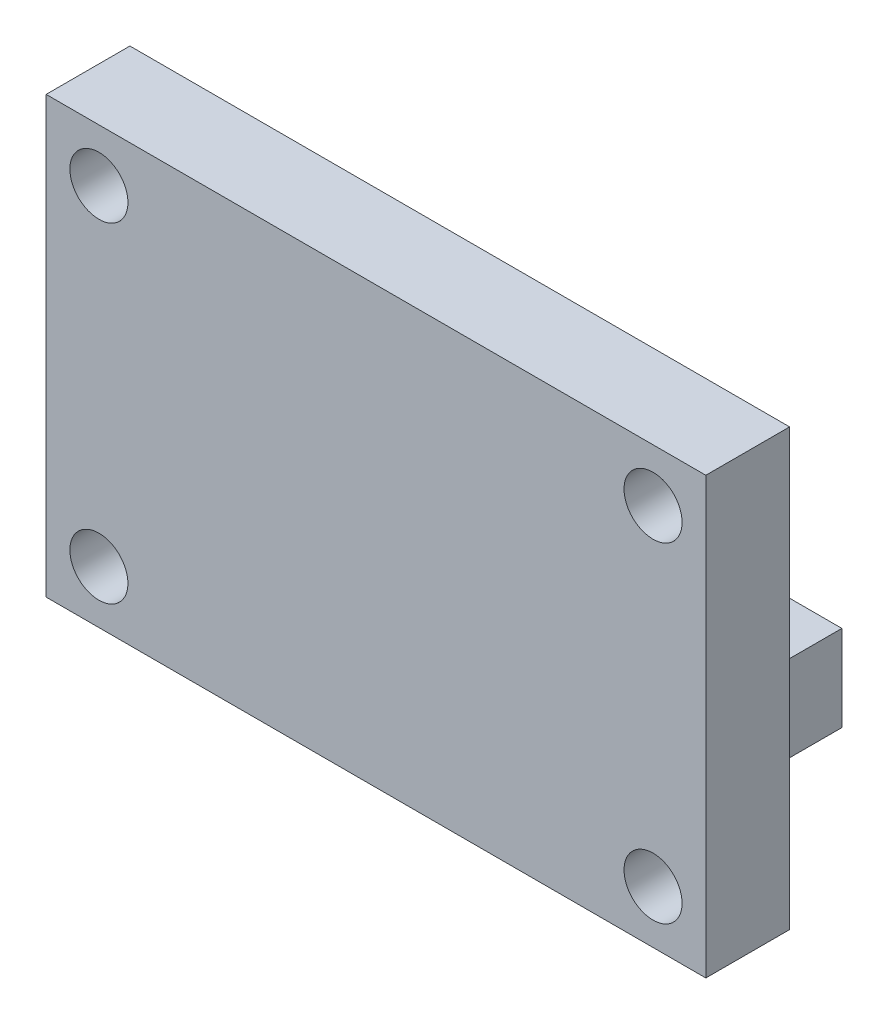
ISO-10303-21;
HEADER;
FILE_DESCRIPTION(('STEP AP214'),'2;1');
FILE_NAME('part.step','',(''),(''),'','','');
FILE_SCHEMA(('AUTOMOTIVE_DESIGN { 1 0 10303 214 1 1 1 1 }'));
ENDSEC;
DATA;
#1=APPLICATION_CONTEXT('core data for automotive mechanical design processes');
#2=APPLICATION_PROTOCOL_DEFINITION('international standard','automotive_design',2000,#1);
#3=PRODUCT_CONTEXT('',#1,'mechanical');
#4=PRODUCT('Part','Part','',(#3));
#5=PRODUCT_RELATED_PRODUCT_CATEGORY('part','',(#4));
#6=PRODUCT_DEFINITION_FORMATION('','',#4);
#7=PRODUCT_DEFINITION_CONTEXT('part definition',#1,'design');
#8=PRODUCT_DEFINITION('design','',#6,#7);
#9=PRODUCT_DEFINITION_SHAPE('','',#8);
#10=(LENGTH_UNIT() NAMED_UNIT(*) SI_UNIT(.MILLI.,.METRE.));
#11=(NAMED_UNIT(*) PLANE_ANGLE_UNIT() SI_UNIT($,.RADIAN.));
#12=(NAMED_UNIT(*) SI_UNIT($,.STERADIAN.) SOLID_ANGLE_UNIT());
#13=UNCERTAINTY_MEASURE_WITH_UNIT(LENGTH_MEASURE(1.E-05),#10,'distance_accuracy_value','');
#14=(GEOMETRIC_REPRESENTATION_CONTEXT(3) GLOBAL_UNCERTAINTY_ASSIGNED_CONTEXT((#13)) GLOBAL_UNIT_ASSIGNED_CONTEXT((#10,
#11,#12)) REPRESENTATION_CONTEXT('',''));
#15=CARTESIAN_POINT('',(0.,0.,0.));
#16=DIRECTION('',(0.,0.,1.));
#17=DIRECTION('',(1.,0.,0.));
#18=AXIS2_PLACEMENT_3D('',#15,#16,#17);
#19=CARTESIAN_POINT('',(0.,0.,-3.175));
#20=DIRECTION('',(0.,0.,1.));
#21=DIRECTION('',(1.,0.,0.));
#22=AXIS2_PLACEMENT_3D('',#19,#20,#21);
#23=PLANE('',#22);
#24=CARTESIAN_POINT('',(-10.2118543920502,9.97230495104325,-3.175));
#25=DIRECTION('',(0.,0.,1.));
#26=DIRECTION('',(1.,0.,0.));
#27=AXIS2_PLACEMENT_3D('',#24,#25,#26);
#28=CIRCLE('',#27,1.1);
#29=CARTESIAN_POINT('',(-9.11185439205018,9.97230495104325,-3.175));
#30=VERTEX_POINT('',#29);
#31=EDGE_CURVE('E220',#30,#30,#28,.T.);
#32=ORIENTED_EDGE('',*,*,#31,.T.);
#33=EDGE_LOOP('',(#32));
#34=FACE_BOUND('',#33,.T.);
#35=CARTESIAN_POINT('',(-10.2118543920502,-2.52769504895675,-3.175));
#36=DIRECTION('',(0.,0.,1.));
#37=DIRECTION('',(1.,0.,0.));
#38=AXIS2_PLACEMENT_3D('',#35,#36,#37);
#39=CIRCLE('',#38,1.1);
#40=CARTESIAN_POINT('',(-9.11185439205018,-2.52769504895675,-3.175));
#41=VERTEX_POINT('',#40);
#42=EDGE_CURVE('E212',#41,#41,#39,.T.);
#43=ORIENTED_EDGE('',*,*,#42,.T.);
#44=EDGE_LOOP('',(#43));
#45=FACE_BOUND('',#44,.T.);
#46=CARTESIAN_POINT('',(10.7881456079498,9.97230495104325,-3.175));
#47=DIRECTION('',(0.,0.,1.));
#48=DIRECTION('',(1.,0.,0.));
#49=AXIS2_PLACEMENT_3D('',#46,#47,#48);
#50=CIRCLE('',#49,1.1);
#51=CARTESIAN_POINT('',(11.8881456079498,9.97230495104325,-3.175));
#52=VERTEX_POINT('',#51);
#53=EDGE_CURVE('E204',#52,#52,#50,.T.);
#54=ORIENTED_EDGE('',*,*,#53,.T.);
#55=EDGE_LOOP('',(#54));
#56=FACE_BOUND('',#55,.T.);
#57=CARTESIAN_POINT('',(10.7881456079498,-2.52769504895675,-3.175));
#58=DIRECTION('',(0.,0.,1.));
#59=DIRECTION('',(1.,0.,0.));
#60=AXIS2_PLACEMENT_3D('',#57,#58,#59);
#61=CIRCLE('',#60,1.1);
#62=CARTESIAN_POINT('',(11.8881456079498,-2.52769504895675,-3.175));
#63=VERTEX_POINT('',#62);
#64=EDGE_CURVE('E196',#63,#63,#61,.T.);
#65=ORIENTED_EDGE('',*,*,#64,.T.);
#66=EDGE_LOOP('',(#65));
#67=FACE_BOUND('',#66,.T.);
#68=DIRECTION('',(1.,0.,0.));
#69=VECTOR('',#68,1.);
#70=CARTESIAN_POINT('',(7.1487666114029,-1.27084971749305,-3.175));
#71=LINE('',#70,#69);
#72=CARTESIAN_POINT('',(1.27,-1.27084971749305,-3.175));
#73=VERTEX_POINT('',#72);
#74=CARTESIAN_POINT('',(7.1487666114029,-1.27084971749305,-3.175));
#75=VERTEX_POINT('',#74);
#76=EDGE_CURVE('E133',#73,#75,#71,.T.);
#77=ORIENTED_EDGE('',*,*,#76,.F.);
#78=DIRECTION('',(0.,1.,0.));
#79=VECTOR('',#78,1.);
#80=CARTESIAN_POINT('',(1.27,0.,-3.175));
#81=LINE('',#80,#79);
#82=CARTESIAN_POINT('',(1.27,6.02181207758508,-3.175));
#83=VERTEX_POINT('',#82);
#84=EDGE_CURVE('E57',#73,#83,#81,.T.);
#85=ORIENTED_EDGE('',*,*,#84,.T.);
#86=DIRECTION('',(1.,0.,0.));
#87=VECTOR('',#86,1.);
#88=CARTESIAN_POINT('',(0.,6.02181207758508,-3.175));
#89=LINE('',#88,#87);
#90=CARTESIAN_POINT('',(-1.27,6.02181207758508,-3.175));
#91=VERTEX_POINT('',#90);
#92=EDGE_CURVE('E61',#83,#91,#89,.F.);
#93=ORIENTED_EDGE('',*,*,#92,.T.);
#94=DIRECTION('',(0.,1.,0.));
#95=VECTOR('',#94,1.);
#96=CARTESIAN_POINT('',(-1.27,0.,-3.175));
#97=LINE('',#96,#95);
#98=CARTESIAN_POINT('',(-1.27,-1.27084971749305,-3.175));
#99=VERTEX_POINT('',#98);
#100=EDGE_CURVE('E135',#99,#91,#97,.T.);
#101=ORIENTED_EDGE('',*,*,#100,.F.);
#102=CARTESIAN_POINT('',(-6.86385312151863,-1.27084971749305,-3.175));
#103=VERTEX_POINT('',#102);
#104=EDGE_CURVE('E122',#103,#99,#71,.T.);
#105=ORIENTED_EDGE('',*,*,#104,.F.);
#106=DIRECTION('',(0.,1.,0.));
#107=VECTOR('',#106,1.);
#108=CARTESIAN_POINT('',(-6.86385312151863,-4.52769504895675,-3.175));
#109=LINE('',#108,#107);
#110=CARTESIAN_POINT('',(-6.86385312151863,-4.52769504895675,-3.175));
#111=VERTEX_POINT('',#110);
#112=EDGE_CURVE('E179',#111,#103,#109,.T.);
#113=ORIENTED_EDGE('',*,*,#112,.F.);
#114=DIRECTION('',(1.,0.,0.));
#115=VECTOR('',#114,1.);
#116=CARTESIAN_POINT('',(-12.2118543920502,-4.52769504895675,-3.175));
#117=LINE('',#116,#115);
#118=CARTESIAN_POINT('',(-12.2118543920502,-4.52769504895675,-3.175));
#119=VERTEX_POINT('',#118);
#120=EDGE_CURVE('E234',#119,#111,#117,.T.);
#121=ORIENTED_EDGE('',*,*,#120,.F.);
#122=DIRECTION('',(0.,-1.,0.));
#123=VECTOR('',#122,1.);
#124=CARTESIAN_POINT('',(-12.2118543920502,11.9723049510433,-3.175));
#125=LINE('',#124,#123);
#126=CARTESIAN_POINT('',(-12.2118543920502,11.9723049510433,-3.175));
#127=VERTEX_POINT('',#126);
#128=EDGE_CURVE('E228',#127,#119,#125,.T.);
#129=ORIENTED_EDGE('',*,*,#128,.F.);
#130=DIRECTION('',(-1.,0.,0.));
#131=VECTOR('',#130,1.);
#132=CARTESIAN_POINT('',(-12.2118543920502,11.9723049510433,-3.175));
#133=LINE('',#132,#131);
#134=CARTESIAN_POINT('',(12.7881456079498,11.9723049510433,-3.175));
#135=VERTEX_POINT('',#134);
#136=EDGE_CURVE('E242',#135,#127,#133,.T.);
#137=ORIENTED_EDGE('',*,*,#136,.F.);
#138=DIRECTION('',(0.,1.,0.));
#139=VECTOR('',#138,1.);
#140=CARTESIAN_POINT('',(12.7881456079498,11.9723049510433,-3.175));
#141=LINE('',#140,#139);
#142=CARTESIAN_POINT('',(12.7881456079498,-4.52769504895675,-3.175));
#143=VERTEX_POINT('',#142);
#144=EDGE_CURVE('E238',#143,#135,#141,.T.);
#145=ORIENTED_EDGE('',*,*,#144,.F.);
#146=CARTESIAN_POINT('',(7.1487666114029,-4.52769504895675,-3.175));
#147=VERTEX_POINT('',#146);
#148=EDGE_CURVE('E232',#147,#143,#117,.T.);
#149=ORIENTED_EDGE('',*,*,#148,.F.);
#150=DIRECTION('',(0.,-1.,0.));
#151=VECTOR('',#150,1.);
#152=CARTESIAN_POINT('',(7.1487666114029,-4.52769504895675,-3.175));
#153=LINE('',#152,#151);
#154=EDGE_CURVE('E162',#75,#147,#153,.T.);
#155=ORIENTED_EDGE('',*,*,#154,.F.);
#156=EDGE_LOOP('',(#77,#85,#93,#101,#105,#113,#121,#129,#137,#145,#149,#155));
#157=FACE_BOUND('',#156,.T.);
#158=ADVANCED_FACE('F39',(#34,#45,#56,#67,#157),#23,.F.);
#159=CARTESIAN_POINT('',(-12.2118543920502,11.9723049510433,-3.175));
#160=DIRECTION('',(-1.,0.,0.));
#161=DIRECTION('',(0.,-1.,0.));
#162=AXIS2_PLACEMENT_3D('',#159,#160,#161);
#163=PLANE('',#162);
#164=DIRECTION('',(0.,-1.,0.));
#165=VECTOR('',#164,1.);
#166=CARTESIAN_POINT('',(-12.2118543920502,11.9723049510433,0.));
#167=LINE('',#166,#165);
#168=CARTESIAN_POINT('',(-12.2118543920502,11.9723049510433,0.));
#169=VERTEX_POINT('',#168);
#170=CARTESIAN_POINT('',(-12.2118543920502,-4.52769504895675,0.));
#171=VERTEX_POINT('',#170);
#172=EDGE_CURVE('E224',#169,#171,#167,.T.);
#173=ORIENTED_EDGE('',*,*,#172,.F.);
#174=DIRECTION('',(0.,0.,1.));
#175=VECTOR('',#174,1.);
#176=CARTESIAN_POINT('',(-12.2118543920502,11.9723049510433,-3.175));
#177=LINE('',#176,#175);
#178=EDGE_CURVE('E11',#127,#169,#177,.T.);
#179=ORIENTED_EDGE('',*,*,#178,.F.);
#180=ORIENTED_EDGE('',*,*,#128,.T.);
#181=DIRECTION('',(0.,0.,1.));
#182=VECTOR('',#181,1.);
#183=CARTESIAN_POINT('',(-12.2118543920502,-4.52769504895675,-3.175));
#184=LINE('',#183,#182);
#185=EDGE_CURVE('E43',#119,#171,#184,.T.);
#186=ORIENTED_EDGE('',*,*,#185,.T.);
#187=EDGE_LOOP('',(#173,#179,#180,#186));
#188=FACE_BOUND('',#187,.T.);
#189=ADVANCED_FACE('F41',(#188),#163,.T.);
#190=CARTESIAN_POINT('',(-12.2118543920502,11.9723049510433,-3.175));
#191=DIRECTION('',(0.,1.,0.));
#192=DIRECTION('',(-1.,0.,0.));
#193=AXIS2_PLACEMENT_3D('',#190,#191,#192);
#194=PLANE('',#193);
#195=DIRECTION('',(-1.,0.,0.));
#196=VECTOR('',#195,1.);
#197=CARTESIAN_POINT('',(-12.2118543920502,11.9723049510433,0.));
#198=LINE('',#197,#196);
#199=CARTESIAN_POINT('',(12.7881456079498,11.9723049510433,0.));
#200=VERTEX_POINT('',#199);
#201=EDGE_CURVE('E233',#200,#169,#198,.T.);
#202=ORIENTED_EDGE('',*,*,#201,.F.);
#203=DIRECTION('',(0.,0.,1.));
#204=VECTOR('',#203,1.);
#205=CARTESIAN_POINT('',(12.7881456079498,11.9723049510433,-3.175));
#206=LINE('',#205,#204);
#207=EDGE_CURVE('E49',#135,#200,#206,.T.);
#208=ORIENTED_EDGE('',*,*,#207,.F.);
#209=ORIENTED_EDGE('',*,*,#136,.T.);
#210=ORIENTED_EDGE('',*,*,#178,.T.);
#211=EDGE_LOOP('',(#202,#208,#209,#210));
#212=FACE_BOUND('',#211,.T.);
#213=ADVANCED_FACE('F278',(#212),#194,.T.);
#214=CARTESIAN_POINT('',(12.7881456079498,11.9723049510433,-3.175));
#215=DIRECTION('',(1.,0.,0.));
#216=DIRECTION('',(0.,1.,0.));
#217=AXIS2_PLACEMENT_3D('',#214,#215,#216);
#218=PLANE('',#217);
#219=DIRECTION('',(0.,1.,0.));
#220=VECTOR('',#219,1.);
#221=CARTESIAN_POINT('',(12.7881456079498,11.9723049510433,0.));
#222=LINE('',#221,#220);
#223=CARTESIAN_POINT('',(12.7881456079498,-4.52769504895675,0.));
#224=VERTEX_POINT('',#223);
#225=EDGE_CURVE('E252',#224,#200,#222,.T.);
#226=ORIENTED_EDGE('',*,*,#225,.F.);
#227=DIRECTION('',(0.,0.,1.));
#228=VECTOR('',#227,1.);
#229=CARTESIAN_POINT('',(12.7881456079498,-4.52769504895675,-3.175));
#230=LINE('',#229,#228);
#231=EDGE_CURVE('E260',#143,#224,#230,.T.);
#232=ORIENTED_EDGE('',*,*,#231,.F.);
#233=ORIENTED_EDGE('',*,*,#144,.T.);
#234=ORIENTED_EDGE('',*,*,#207,.T.);
#235=EDGE_LOOP('',(#226,#232,#233,#234));
#236=FACE_BOUND('',#235,.T.);
#237=ADVANCED_FACE('F349',(#236),#218,.T.);
#238=CARTESIAN_POINT('',(-12.2118543920502,-4.52769504895675,-3.175));
#239=DIRECTION('',(0.,-1.,0.));
#240=DIRECTION('',(1.,0.,0.));
#241=AXIS2_PLACEMENT_3D('',#238,#239,#240);
#242=PLANE('',#241);
#243=CARTESIAN_POINT('',(-4.86385312151863,-4.52769504895675,-8.795));
#244=DIRECTION('',(0.,1.,0.));
#245=DIRECTION('',(0.,0.,1.));
#246=AXIS2_PLACEMENT_3D('',#243,#244,#245);
#247=CIRCLE('',#246,1.1);
#248=CARTESIAN_POINT('',(-4.86385312151863,-4.52769504895675,-7.695));
#249=VERTEX_POINT('',#248);
#250=EDGE_CURVE('E302',#249,#249,#247,.T.);
#251=ORIENTED_EDGE('',*,*,#250,.T.);
#252=EDGE_LOOP('',(#251));
#253=FACE_BOUND('',#252,.T.);
#254=CARTESIAN_POINT('',(5.1487666114029,-4.52769504895675,-8.795));
#255=DIRECTION('',(0.,1.,0.));
#256=DIRECTION('',(0.,0.,1.));
#257=AXIS2_PLACEMENT_3D('',#254,#255,#256);
#258=CIRCLE('',#257,1.1);
#259=CARTESIAN_POINT('',(5.1487666114029,-4.52769504895675,-7.695));
#260=VERTEX_POINT('',#259);
#261=EDGE_CURVE('E311',#260,#260,#258,.T.);
#262=ORIENTED_EDGE('',*,*,#261,.T.);
#263=EDGE_LOOP('',(#262));
#264=FACE_BOUND('',#263,.T.);
#265=ORIENTED_EDGE('',*,*,#231,.T.);
#266=DIRECTION('',(1.,0.,0.));
#267=VECTOR('',#266,1.);
#268=CARTESIAN_POINT('',(-12.2118543920502,-4.52769504895675,0.));
#269=LINE('',#268,#267);
#270=EDGE_CURVE('E249',#171,#224,#269,.T.);
#271=ORIENTED_EDGE('',*,*,#270,.F.);
#272=ORIENTED_EDGE('',*,*,#185,.F.);
#273=ORIENTED_EDGE('',*,*,#120,.T.);
#274=DIRECTION('',(0.,0.,1.));
#275=VECTOR('',#274,1.);
#276=CARTESIAN_POINT('',(-6.86385312151863,-4.52769504895675,-10.795));
#277=LINE('',#276,#275);
#278=CARTESIAN_POINT('',(-6.86385312151863,-4.52769504895675,-10.795));
#279=VERTEX_POINT('',#278);
#280=EDGE_CURVE('E187',#279,#111,#277,.T.);
#281=ORIENTED_EDGE('',*,*,#280,.F.);
#282=DIRECTION('',(-1.,0.,0.));
#283=VECTOR('',#282,1.);
#284=CARTESIAN_POINT('',(7.1487666114029,-4.52769504895675,-10.795));
#285=LINE('',#284,#283);
#286=CARTESIAN_POINT('',(7.1487666114029,-4.52769504895675,-10.795));
#287=VERTEX_POINT('',#286);
#288=EDGE_CURVE('E166',#287,#279,#285,.T.);
#289=ORIENTED_EDGE('',*,*,#288,.F.);
#290=DIRECTION('',(0.,0.,1.));
#291=VECTOR('',#290,1.);
#292=CARTESIAN_POINT('',(7.1487666114029,-4.52769504895675,-10.795));
#293=LINE('',#292,#291);
#294=EDGE_CURVE('E191',#287,#147,#293,.T.);
#295=ORIENTED_EDGE('',*,*,#294,.T.);
#296=ORIENTED_EDGE('',*,*,#148,.T.);
#297=EDGE_LOOP('',(#265,#271,#272,#273,#281,#289,#295,#296));
#298=FACE_BOUND('',#297,.T.);
#299=ADVANCED_FACE('F272',(#253,#264,#298),#242,.T.);
#300=CARTESIAN_POINT('',(0.,0.,0.));
#301=DIRECTION('',(0.,0.,1.));
#302=DIRECTION('',(1.,0.,0.));
#303=AXIS2_PLACEMENT_3D('',#300,#301,#302);
#304=PLANE('',#303);
#305=ORIENTED_EDGE('',*,*,#270,.T.);
#306=ORIENTED_EDGE('',*,*,#225,.T.);
#307=ORIENTED_EDGE('',*,*,#201,.T.);
#308=ORIENTED_EDGE('',*,*,#172,.T.);
#309=EDGE_LOOP('',(#305,#306,#307,#308));
#310=FACE_BOUND('',#309,.T.);
#311=CARTESIAN_POINT('',(10.7881456079498,-2.52769504895675,0.));
#312=DIRECTION('',(0.,0.,1.));
#313=DIRECTION('',(1.,0.,0.));
#314=AXIS2_PLACEMENT_3D('',#311,#312,#313);
#315=CIRCLE('',#314,1.1);
#316=CARTESIAN_POINT('',(11.8881456079498,-2.52769504895675,0.));
#317=VERTEX_POINT('',#316);
#318=EDGE_CURVE('E195',#317,#317,#315,.T.);
#319=ORIENTED_EDGE('',*,*,#318,.F.);
#320=EDGE_LOOP('',(#319));
#321=FACE_BOUND('',#320,.T.);
#322=CARTESIAN_POINT('',(10.7881456079498,9.97230495104325,0.));
#323=DIRECTION('',(0.,0.,1.));
#324=DIRECTION('',(1.,0.,0.));
#325=AXIS2_PLACEMENT_3D('',#322,#323,#324);
#326=CIRCLE('',#325,1.1);
#327=CARTESIAN_POINT('',(11.8881456079498,9.97230495104325,0.));
#328=VERTEX_POINT('',#327);
#329=EDGE_CURVE('E200',#328,#328,#326,.T.);
#330=ORIENTED_EDGE('',*,*,#329,.F.);
#331=EDGE_LOOP('',(#330));
#332=FACE_BOUND('',#331,.T.);
#333=CARTESIAN_POINT('',(-10.2118543920502,-2.52769504895675,0.));
#334=DIRECTION('',(0.,0.,1.));
#335=DIRECTION('',(1.,0.,0.));
#336=AXIS2_PLACEMENT_3D('',#333,#334,#335);
#337=CIRCLE('',#336,1.1);
#338=CARTESIAN_POINT('',(-9.11185439205018,-2.52769504895675,0.));
#339=VERTEX_POINT('',#338);
#340=EDGE_CURVE('E208',#339,#339,#337,.T.);
#341=ORIENTED_EDGE('',*,*,#340,.F.);
#342=EDGE_LOOP('',(#341));
#343=FACE_BOUND('',#342,.T.);
#344=CARTESIAN_POINT('',(-10.2118543920502,9.97230495104325,0.));
#345=DIRECTION('',(0.,0.,1.));
#346=DIRECTION('',(1.,0.,0.));
#347=AXIS2_PLACEMENT_3D('',#344,#345,#346);
#348=CIRCLE('',#347,1.1);
#349=CARTESIAN_POINT('',(-9.11185439205018,9.97230495104325,0.));
#350=VERTEX_POINT('',#349);
#351=EDGE_CURVE('E216',#350,#350,#348,.T.);
#352=ORIENTED_EDGE('',*,*,#351,.F.);
#353=EDGE_LOOP('',(#352));
#354=FACE_BOUND('',#353,.T.);
#355=ADVANCED_FACE('F274',(#310,#321,#332,#343,#354),#304,.T.);
#356=CARTESIAN_POINT('',(-10.2118543920502,9.97230495104325,-3.175));
#357=DIRECTION('',(0.,0.,1.));
#358=DIRECTION('',(1.,0.,0.));
#359=AXIS2_PLACEMENT_3D('',#356,#357,#358);
#360=CYLINDRICAL_SURFACE('',#359,1.1);
#361=ORIENTED_EDGE('',*,*,#31,.F.);
#362=EDGE_LOOP('',(#361));
#363=FACE_BOUND('',#362,.T.);
#364=ORIENTED_EDGE('',*,*,#351,.T.);
#365=EDGE_LOOP('',(#364));
#366=FACE_BOUND('',#365,.T.);
#367=ADVANCED_FACE('F343',(#363,#366),#360,.F.);
#368=CARTESIAN_POINT('',(-10.2118543920502,-2.52769504895675,-3.175));
#369=DIRECTION('',(0.,0.,1.));
#370=DIRECTION('',(1.,0.,0.));
#371=AXIS2_PLACEMENT_3D('',#368,#369,#370);
#372=CYLINDRICAL_SURFACE('',#371,1.1);
#373=ORIENTED_EDGE('',*,*,#42,.F.);
#374=EDGE_LOOP('',(#373));
#375=FACE_BOUND('',#374,.T.);
#376=ORIENTED_EDGE('',*,*,#340,.T.);
#377=EDGE_LOOP('',(#376));
#378=FACE_BOUND('',#377,.T.);
#379=ADVANCED_FACE('F457',(#375,#378),#372,.F.);
#380=CARTESIAN_POINT('',(10.7881456079498,9.97230495104325,-3.175));
#381=DIRECTION('',(0.,0.,1.));
#382=DIRECTION('',(1.,0.,0.));
#383=AXIS2_PLACEMENT_3D('',#380,#381,#382);
#384=CYLINDRICAL_SURFACE('',#383,1.1);
#385=ORIENTED_EDGE('',*,*,#53,.F.);
#386=EDGE_LOOP('',(#385));
#387=FACE_BOUND('',#386,.T.);
#388=ORIENTED_EDGE('',*,*,#329,.T.);
#389=EDGE_LOOP('',(#388));
#390=FACE_BOUND('',#389,.T.);
#391=ADVANCED_FACE('F447',(#387,#390),#384,.F.);
#392=CARTESIAN_POINT('',(10.7881456079498,-2.52769504895675,-3.175));
#393=DIRECTION('',(0.,0.,1.));
#394=DIRECTION('',(1.,0.,0.));
#395=AXIS2_PLACEMENT_3D('',#392,#393,#394);
#396=CYLINDRICAL_SURFACE('',#395,1.1);
#397=ORIENTED_EDGE('',*,*,#64,.F.);
#398=EDGE_LOOP('',(#397));
#399=FACE_BOUND('',#398,.T.);
#400=ORIENTED_EDGE('',*,*,#318,.T.);
#401=EDGE_LOOP('',(#400));
#402=FACE_BOUND('',#401,.T.);
#403=ADVANCED_FACE('F439',(#399,#402),#396,.F.);
#404=CARTESIAN_POINT('',(7.1487666114029,-4.52769504895675,-10.795));
#405=DIRECTION('',(-1.,0.,0.));
#406=DIRECTION('',(0.,0.,1.));
#407=AXIS2_PLACEMENT_3D('',#404,#405,#406);
#408=PLANE('',#407);
#409=ORIENTED_EDGE('',*,*,#154,.T.);
#410=ORIENTED_EDGE('',*,*,#294,.F.);
#411=DIRECTION('',(0.,-1.,0.));
#412=VECTOR('',#411,1.);
#413=CARTESIAN_POINT('',(7.1487666114029,-4.52769504895675,-10.795));
#414=LINE('',#413,#412);
#415=CARTESIAN_POINT('',(7.1487666114029,-1.27084971749305,-10.795));
#416=VERTEX_POINT('',#415);
#417=EDGE_CURVE('E132',#416,#287,#414,.T.);
#418=ORIENTED_EDGE('',*,*,#417,.F.);
#419=DIRECTION('',(0.,0.,1.));
#420=VECTOR('',#419,1.);
#421=CARTESIAN_POINT('',(7.1487666114029,-1.27084971749305,-10.795));
#422=LINE('',#421,#420);
#423=EDGE_CURVE('E175',#416,#75,#422,.T.);
#424=ORIENTED_EDGE('',*,*,#423,.T.);
#425=EDGE_LOOP('',(#409,#410,#418,#424));
#426=FACE_BOUND('',#425,.T.);
#427=ADVANCED_FACE('F292',(#426),#408,.F.);
#428=CARTESIAN_POINT('',(-6.86385312151863,-4.52769504895675,-10.795));
#429=DIRECTION('',(1.,0.,0.));
#430=DIRECTION('',(0.,0.,-1.));
#431=AXIS2_PLACEMENT_3D('',#428,#429,#430);
#432=PLANE('',#431);
#433=ORIENTED_EDGE('',*,*,#112,.T.);
#434=DIRECTION('',(0.,0.,1.));
#435=VECTOR('',#434,1.);
#436=CARTESIAN_POINT('',(-6.86385312151863,-1.27084971749305,-10.795));
#437=LINE('',#436,#435);
#438=CARTESIAN_POINT('',(-6.86385312151863,-1.27084971749305,-10.795));
#439=VERTEX_POINT('',#438);
#440=EDGE_CURVE('E129',#439,#103,#437,.T.);
#441=ORIENTED_EDGE('',*,*,#440,.F.);
#442=DIRECTION('',(0.,1.,0.));
#443=VECTOR('',#442,1.);
#444=CARTESIAN_POINT('',(-6.86385312151863,-4.52769504895675,-10.795));
#445=LINE('',#444,#443);
#446=EDGE_CURVE('E169',#279,#439,#445,.T.);
#447=ORIENTED_EDGE('',*,*,#446,.F.);
#448=ORIENTED_EDGE('',*,*,#280,.T.);
#449=EDGE_LOOP('',(#433,#441,#447,#448));
#450=FACE_BOUND('',#449,.T.);
#451=ADVANCED_FACE('F284',(#450),#432,.F.);
#452=CARTESIAN_POINT('',(7.1487666114029,-1.27084971749305,-10.795));
#453=DIRECTION('',(0.,-1.,0.));
#454=DIRECTION('',(0.,0.,-1.));
#455=AXIS2_PLACEMENT_3D('',#452,#453,#454);
#456=PLANE('',#455);
#457=CARTESIAN_POINT('',(-4.86385312151863,-1.27084971749305,-8.795));
#458=DIRECTION('',(0.,1.,0.));
#459=DIRECTION('',(0.,0.,1.));
#460=AXIS2_PLACEMENT_3D('',#457,#458,#459);
#461=CIRCLE('',#460,1.1);
#462=CARTESIAN_POINT('',(-4.86385312151863,-1.27084971749305,-7.695));
#463=VERTEX_POINT('',#462);
#464=EDGE_CURVE('E305',#463,#463,#461,.T.);
#465=ORIENTED_EDGE('',*,*,#464,.F.);
#466=EDGE_LOOP('',(#465));
#467=FACE_BOUND('',#466,.T.);
#468=CARTESIAN_POINT('',(5.1487666114029,-1.27084971749305,-8.795));
#469=DIRECTION('',(0.,1.,0.));
#470=DIRECTION('',(0.,0.,1.));
#471=AXIS2_PLACEMENT_3D('',#468,#469,#470);
#472=CIRCLE('',#471,1.1);
#473=CARTESIAN_POINT('',(5.1487666114029,-1.27084971749305,-7.695));
#474=VERTEX_POINT('',#473);
#475=EDGE_CURVE('E317',#474,#474,#472,.T.);
#476=ORIENTED_EDGE('',*,*,#475,.F.);
#477=EDGE_LOOP('',(#476));
#478=FACE_BOUND('',#477,.T.);
#479=DIRECTION('',(-1.,0.,0.));
#480=VECTOR('',#479,1.);
#481=CARTESIAN_POINT('',(7.1487666114029,-1.27084971749305,-8.94141266451955));
#482=LINE('',#481,#480);
#483=CARTESIAN_POINT('',(-1.27,-1.27084971749305,-8.94141266451955));
#484=VERTEX_POINT('',#483);
#485=CARTESIAN_POINT('',(1.27,-1.27084971749305,-8.94141266451955));
#486=VERTEX_POINT('',#485);
#487=EDGE_CURVE('E157',#484,#486,#482,.F.);
#488=ORIENTED_EDGE('',*,*,#487,.T.);
#489=DIRECTION('',(0.,0.,1.));
#490=VECTOR('',#489,1.);
#491=CARTESIAN_POINT('',(1.27,-1.27084971749305,-10.795));
#492=LINE('',#491,#490);
#493=EDGE_CURVE('E140',#486,#73,#492,.T.);
#494=ORIENTED_EDGE('',*,*,#493,.T.);
#495=ORIENTED_EDGE('',*,*,#76,.T.);
#496=ORIENTED_EDGE('',*,*,#423,.F.);
#497=DIRECTION('',(1.,0.,0.));
#498=VECTOR('',#497,1.);
#499=CARTESIAN_POINT('',(7.1487666114029,-1.27084971749305,-10.795));
#500=LINE('',#499,#498);
#501=EDGE_CURVE('E172',#439,#416,#500,.T.);
#502=ORIENTED_EDGE('',*,*,#501,.F.);
#503=ORIENTED_EDGE('',*,*,#440,.T.);
#504=ORIENTED_EDGE('',*,*,#104,.T.);
#505=DIRECTION('',(0.,0.,1.));
#506=VECTOR('',#505,1.);
#507=CARTESIAN_POINT('',(-1.27,-1.27084971749305,-10.795));
#508=LINE('',#507,#506);
#509=EDGE_CURVE('E125',#484,#99,#508,.T.);
#510=ORIENTED_EDGE('',*,*,#509,.F.);
#511=EDGE_LOOP('',(#488,#494,#495,#496,#502,#503,#504,#510));
#512=FACE_BOUND('',#511,.T.);
#513=ADVANCED_FACE('F123',(#467,#478,#512),#456,.F.);
#514=CARTESIAN_POINT('',(0.,0.,-10.795));
#515=DIRECTION('',(0.,0.,1.));
#516=DIRECTION('',(1.,0.,0.));
#517=AXIS2_PLACEMENT_3D('',#514,#515,#516);
#518=PLANE('',#517);
#519=ORIENTED_EDGE('',*,*,#288,.T.);
#520=ORIENTED_EDGE('',*,*,#446,.T.);
#521=ORIENTED_EDGE('',*,*,#501,.T.);
#522=ORIENTED_EDGE('',*,*,#417,.T.);
#523=EDGE_LOOP('',(#519,#520,#521,#522));
#524=FACE_BOUND('',#523,.T.);
#525=ADVANCED_FACE('F286',(#524),#518,.F.);
#526=CARTESIAN_POINT('',(0.,6.02181207758508,-3.175));
#527=DIRECTION('',(0.,-0.620243654590527,0.784409210132178));
#528=DIRECTION('',(0.,-0.784409210132178,-0.620243654590526));
#529=AXIS2_PLACEMENT_3D('',#526,#527,#528);
#530=PLANE('',#529);
#531=ORIENTED_EDGE('',*,*,#92,.F.);
#532=DIRECTION('',(0.,-0.784409210132178,-0.620243654590526));
#533=VECTOR('',#532,1.);
#534=CARTESIAN_POINT('',(1.27,6.02181207758508,-3.175));
#535=LINE('',#534,#533);
#536=EDGE_CURVE('E145',#83,#486,#535,.T.);
#537=ORIENTED_EDGE('',*,*,#536,.T.);
#538=ORIENTED_EDGE('',*,*,#487,.F.);
#539=DIRECTION('',(0.,-0.784409210132178,-0.620243654590526));
#540=VECTOR('',#539,1.);
#541=CARTESIAN_POINT('',(-1.27,6.02181207758508,-3.175));
#542=LINE('',#541,#540);
#543=EDGE_CURVE('E143',#91,#484,#542,.T.);
#544=ORIENTED_EDGE('',*,*,#543,.F.);
#545=EDGE_LOOP('',(#531,#537,#538,#544));
#546=FACE_BOUND('',#545,.T.);
#547=ADVANCED_FACE('F300',(#546),#530,.F.);
#548=CARTESIAN_POINT('',(1.27,3.72230495104325,-5.3975));
#549=DIRECTION('',(1.,0.,0.));
#550=DIRECTION('',(0.,0.,-1.));
#551=AXIS2_PLACEMENT_3D('',#548,#549,#550);
#552=PLANE('',#551);
#553=ORIENTED_EDGE('',*,*,#84,.F.);
#554=ORIENTED_EDGE('',*,*,#493,.F.);
#555=ORIENTED_EDGE('',*,*,#536,.F.);
#556=EDGE_LOOP('',(#553,#554,#555));
#557=FACE_BOUND('',#556,.T.);
#558=ADVANCED_FACE('F298',(#557),#552,.T.);
#559=CARTESIAN_POINT('',(-1.27,3.72230495104325,-5.3975));
#560=DIRECTION('',(1.,0.,0.));
#561=DIRECTION('',(0.,0.,-1.));
#562=AXIS2_PLACEMENT_3D('',#559,#560,#561);
#563=PLANE('',#562);
#564=ORIENTED_EDGE('',*,*,#509,.T.);
#565=ORIENTED_EDGE('',*,*,#100,.T.);
#566=ORIENTED_EDGE('',*,*,#543,.T.);
#567=EDGE_LOOP('',(#564,#565,#566));
#568=FACE_BOUND('',#567,.T.);
#569=ADVANCED_FACE('F142',(#568),#563,.F.);
#570=CARTESIAN_POINT('',(5.1487666114029,-4.52769504895675,-8.795));
#571=DIRECTION('',(0.,1.,0.));
#572=DIRECTION('',(0.,0.,1.));
#573=AXIS2_PLACEMENT_3D('',#570,#571,#572);
#574=CYLINDRICAL_SURFACE('',#573,1.1);
#575=ORIENTED_EDGE('',*,*,#261,.F.);
#576=EDGE_LOOP('',(#575));
#577=FACE_BOUND('',#576,.T.);
#578=ORIENTED_EDGE('',*,*,#475,.T.);
#579=EDGE_LOOP('',(#578));
#580=FACE_BOUND('',#579,.T.);
#581=ADVANCED_FACE('F322',(#577,#580),#574,.F.);
#582=CARTESIAN_POINT('',(-4.86385312151863,-4.52769504895675,-8.795));
#583=DIRECTION('',(0.,1.,0.));
#584=DIRECTION('',(0.,0.,1.));
#585=AXIS2_PLACEMENT_3D('',#582,#583,#584);
#586=CYLINDRICAL_SURFACE('',#585,1.1);
#587=ORIENTED_EDGE('',*,*,#250,.F.);
#588=EDGE_LOOP('',(#587));
#589=FACE_BOUND('',#588,.T.);
#590=ORIENTED_EDGE('',*,*,#464,.T.);
#591=EDGE_LOOP('',(#590));
#592=FACE_BOUND('',#591,.T.);
#593=ADVANCED_FACE('F359',(#589,#592),#586,.F.);
#594=CLOSED_SHELL('',(#158,#189,#213,#237,#299,#355,#367,#379,#391,#403,#427,#451,#513,#525,
#547,#558,#569,#581,#593));
#595=MANIFOLD_SOLID_BREP('B2',#594);
#596=ADVANCED_BREP_SHAPE_REPRESENTATION('',(#18,#595),#14);
#597=SHAPE_DEFINITION_REPRESENTATION(#9,#596);
ENDSEC;
END-ISO-10303-21;
